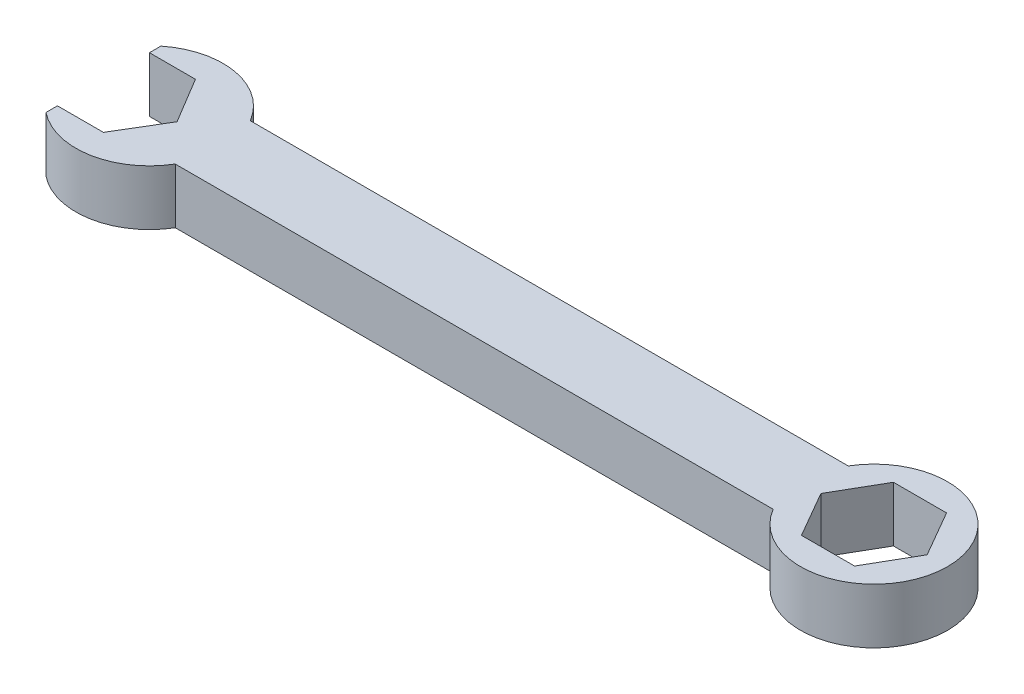
ISO-10303-21;
HEADER;
FILE_DESCRIPTION(('STEP AP214'),'2;1');
FILE_NAME('part.step','',(''),(''),'','','');
FILE_SCHEMA(('AUTOMOTIVE_DESIGN { 1 0 10303 214 1 1 1 1 }'));
ENDSEC;
DATA;
#1=APPLICATION_CONTEXT('core data for automotive mechanical design processes');
#2=APPLICATION_PROTOCOL_DEFINITION('international standard','automotive_design',2000,#1);
#3=PRODUCT_CONTEXT('',#1,'mechanical');
#4=PRODUCT('Part','Part','',(#3));
#5=PRODUCT_RELATED_PRODUCT_CATEGORY('part','',(#4));
#6=PRODUCT_DEFINITION_FORMATION('','',#4);
#7=PRODUCT_DEFINITION_CONTEXT('part definition',#1,'design');
#8=PRODUCT_DEFINITION('design','',#6,#7);
#9=PRODUCT_DEFINITION_SHAPE('','',#8);
#10=(LENGTH_UNIT() NAMED_UNIT(*) SI_UNIT(.MILLI.,.METRE.));
#11=(NAMED_UNIT(*) PLANE_ANGLE_UNIT() SI_UNIT($,.RADIAN.));
#12=(NAMED_UNIT(*) SI_UNIT($,.STERADIAN.) SOLID_ANGLE_UNIT());
#13=UNCERTAINTY_MEASURE_WITH_UNIT(LENGTH_MEASURE(1.E-05),#10,'distance_accuracy_value','');
#14=(GEOMETRIC_REPRESENTATION_CONTEXT(3) GLOBAL_UNCERTAINTY_ASSIGNED_CONTEXT((#13)) GLOBAL_UNIT_ASSIGNED_CONTEXT((#10,
#11,#12)) REPRESENTATION_CONTEXT('',''));
#15=CARTESIAN_POINT('',(0.,0.,0.));
#16=DIRECTION('',(0.,0.,1.));
#17=DIRECTION('',(1.,0.,0.));
#18=AXIS2_PLACEMENT_3D('',#15,#16,#17);
#19=CARTESIAN_POINT('',(77.6662616781043,7.62,-44.8406370868056));
#20=DIRECTION('',(-0.866025403784438,0.,0.500000000000001));
#21=DIRECTION('',(0.500000000000001,0.,0.866025403784438));
#22=AXIS2_PLACEMENT_3D('',#19,#20,#21);
#23=PLANE('',#22);
#24=DIRECTION('',(-0.500000000000001,0.,-0.866025403784438));
#25=VECTOR('',#24,1.);
#26=CARTESIAN_POINT('',(77.6662616781043,0.,-44.8406370868056));
#27=LINE('',#26,#25);
#28=CARTESIAN_POINT('',(103.555015570806,0.,0.));
#29=VERTEX_POINT('',#28);
#30=CARTESIAN_POINT('',(99.8888413614518,0.,-6.35000000000001));
#31=VERTEX_POINT('',#30);
#32=EDGE_CURVE('E248',#29,#31,#27,.T.);
#33=ORIENTED_EDGE('',*,*,#32,.F.);
#34=DIRECTION('',(0.,-1.,0.));
#35=VECTOR('',#34,1.);
#36=CARTESIAN_POINT('',(103.555015570806,7.62,0.));
#37=LINE('',#36,#35);
#38=CARTESIAN_POINT('',(103.555015570806,7.62,0.));
#39=VERTEX_POINT('',#38);
#40=EDGE_CURVE('E11',#39,#29,#37,.T.);
#41=ORIENTED_EDGE('',*,*,#40,.F.);
#42=DIRECTION('',(-0.500000000000001,0.,-0.866025403784438));
#43=VECTOR('',#42,1.);
#44=CARTESIAN_POINT('',(77.6662616781043,7.62,-44.8406370868056));
#45=LINE('',#44,#43);
#46=CARTESIAN_POINT('',(99.8888413614518,7.62,-6.35000000000001));
#47=VERTEX_POINT('',#46);
#48=EDGE_CURVE('E363',#39,#47,#45,.T.);
#49=ORIENTED_EDGE('',*,*,#48,.T.);
#50=DIRECTION('',(0.,-1.,0.));
#51=VECTOR('',#50,1.);
#52=CARTESIAN_POINT('',(99.8888413614518,7.62,-6.35000000000001));
#53=LINE('',#52,#51);
#54=EDGE_CURVE('E67',#47,#31,#53,.T.);
#55=ORIENTED_EDGE('',*,*,#54,.T.);
#56=EDGE_LOOP('',(#33,#41,#49,#55));
#57=FACE_BOUND('',#56,.T.);
#58=ADVANCED_FACE('F47',(#57),#23,.T.);
#59=CARTESIAN_POINT('',(77.6662616781043,7.62,44.8406370868056));
#60=DIRECTION('',(0.866025403784438,0.,0.500000000000001));
#61=DIRECTION('',(0.500000000000001,0.,-0.866025403784438));
#62=AXIS2_PLACEMENT_3D('',#59,#60,#61);
#63=PLANE('',#62);
#64=DIRECTION('',(-0.500000000000001,0.,0.866025403784438));
#65=VECTOR('',#64,1.);
#66=CARTESIAN_POINT('',(77.6662616781043,0.,44.8406370868056));
#67=LINE('',#66,#65);
#68=CARTESIAN_POINT('',(99.8888413614518,0.,6.35000000000001));
#69=VERTEX_POINT('',#68);
#70=EDGE_CURVE('E251',#29,#69,#67,.T.);
#71=ORIENTED_EDGE('',*,*,#70,.T.);
#72=DIRECTION('',(0.,-1.,0.));
#73=VECTOR('',#72,1.);
#74=CARTESIAN_POINT('',(99.8888413614518,7.62,6.35000000000001));
#75=LINE('',#74,#73);
#76=CARTESIAN_POINT('',(99.8888413614518,7.62,6.35000000000001));
#77=VERTEX_POINT('',#76);
#78=EDGE_CURVE('E58',#77,#69,#75,.T.);
#79=ORIENTED_EDGE('',*,*,#78,.F.);
#80=DIRECTION('',(-0.500000000000001,0.,0.866025403784438));
#81=VECTOR('',#80,1.);
#82=CARTESIAN_POINT('',(77.6662616781043,7.62,44.8406370868056));
#83=LINE('',#82,#81);
#84=EDGE_CURVE('E366',#39,#77,#83,.T.);
#85=ORIENTED_EDGE('',*,*,#84,.F.);
#86=ORIENTED_EDGE('',*,*,#40,.T.);
#87=EDGE_LOOP('',(#71,#79,#85,#86));
#88=FACE_BOUND('',#87,.T.);
#89=ADVANCED_FACE('F372',(#88),#63,.F.);
#90=CARTESIAN_POINT('',(0.,7.62,6.35));
#91=DIRECTION('',(0.,0.,1.));
#92=DIRECTION('',(1.,0.,0.));
#93=AXIS2_PLACEMENT_3D('',#90,#91,#92);
#94=PLANE('',#93);
#95=DIRECTION('',(-1.,0.,0.));
#96=VECTOR('',#95,1.);
#97=CARTESIAN_POINT('',(0.,0.,6.35));
#98=LINE('',#97,#96);
#99=CARTESIAN_POINT('',(92.5564929427435,0.,6.35000000000001));
#100=VERTEX_POINT('',#99);
#101=EDGE_CURVE('E255',#69,#100,#98,.T.);
#102=ORIENTED_EDGE('',*,*,#101,.T.);
#103=DIRECTION('',(0.,-1.,0.));
#104=VECTOR('',#103,1.);
#105=CARTESIAN_POINT('',(92.5564929427435,7.62,6.35000000000001));
#106=LINE('',#105,#104);
#107=CARTESIAN_POINT('',(92.5564929427435,7.62,6.35000000000001));
#108=VERTEX_POINT('',#107);
#109=EDGE_CURVE('E196',#108,#100,#106,.T.);
#110=ORIENTED_EDGE('',*,*,#109,.F.);
#111=DIRECTION('',(-1.,0.,0.));
#112=VECTOR('',#111,1.);
#113=CARTESIAN_POINT('',(0.,7.62,6.35));
#114=LINE('',#113,#112);
#115=EDGE_CURVE('E183',#77,#108,#114,.T.);
#116=ORIENTED_EDGE('',*,*,#115,.F.);
#117=ORIENTED_EDGE('',*,*,#78,.T.);
#118=EDGE_LOOP('',(#102,#110,#116,#117));
#119=FACE_BOUND('',#118,.T.);
#120=ADVANCED_FACE('F375',(#119),#94,.F.);
#121=CARTESIAN_POINT('',(66.6677390500421,7.62,-38.4906370868055));
#122=DIRECTION('',(-0.866025403784439,0.,0.499999999999999));
#123=DIRECTION('',(0.5,0.,0.866025403784439));
#124=AXIS2_PLACEMENT_3D('',#121,#122,#123);
#125=PLANE('',#124);
#126=DIRECTION('',(-0.499999999999999,0.,-0.866025403784439));
#127=VECTOR('',#126,1.);
#128=CARTESIAN_POINT('',(66.6677390500421,0.,-38.4906370868055));
#129=LINE('',#128,#127);
#130=CARTESIAN_POINT('',(88.8903187333894,0.,0.));
#131=VERTEX_POINT('',#130);
#132=EDGE_CURVE('E192',#100,#131,#129,.T.);
#133=ORIENTED_EDGE('',*,*,#132,.T.);
#134=DIRECTION('',(0.,-1.,0.));
#135=VECTOR('',#134,1.);
#136=CARTESIAN_POINT('',(88.8903187333894,7.62,0.));
#137=LINE('',#136,#135);
#138=CARTESIAN_POINT('',(88.8903187333894,7.62,0.));
#139=VERTEX_POINT('',#138);
#140=EDGE_CURVE('E190',#139,#131,#137,.T.);
#141=ORIENTED_EDGE('',*,*,#140,.F.);
#142=DIRECTION('',(-0.499999999999999,0.,-0.866025403784439));
#143=VECTOR('',#142,1.);
#144=CARTESIAN_POINT('',(66.6677390500421,7.62,-38.4906370868055));
#145=LINE('',#144,#143);
#146=EDGE_CURVE('E175',#108,#139,#145,.T.);
#147=ORIENTED_EDGE('',*,*,#146,.F.);
#148=ORIENTED_EDGE('',*,*,#109,.T.);
#149=EDGE_LOOP('',(#133,#141,#147,#148));
#150=FACE_BOUND('',#149,.T.);
#151=ADVANCED_FACE('F191',(#150),#125,.F.);
#152=CARTESIAN_POINT('',(66.667739050042,7.62,38.4906370868055));
#153=DIRECTION('',(0.866025403784439,0.,0.5));
#154=DIRECTION('',(0.5,0.,-0.866025403784439));
#155=AXIS2_PLACEMENT_3D('',#152,#153,#154);
#156=PLANE('',#155);
#157=DIRECTION('',(-0.5,0.,0.866025403784439));
#158=VECTOR('',#157,1.);
#159=CARTESIAN_POINT('',(66.667739050042,0.,38.4906370868055));
#160=LINE('',#159,#158);
#161=CARTESIAN_POINT('',(92.5564929427435,0.,-6.35000000000001));
#162=VERTEX_POINT('',#161);
#163=EDGE_CURVE('E261',#162,#131,#160,.T.);
#164=ORIENTED_EDGE('',*,*,#163,.F.);
#165=DIRECTION('',(0.,-1.,0.));
#166=VECTOR('',#165,1.);
#167=CARTESIAN_POINT('',(92.5564929427435,7.62,-6.35000000000001));
#168=LINE('',#167,#166);
#169=CARTESIAN_POINT('',(92.5564929427435,7.62,-6.35000000000001));
#170=VERTEX_POINT('',#169);
#171=EDGE_CURVE('E119',#170,#162,#168,.T.);
#172=ORIENTED_EDGE('',*,*,#171,.F.);
#173=DIRECTION('',(-0.5,0.,0.866025403784439));
#174=VECTOR('',#173,1.);
#175=CARTESIAN_POINT('',(66.667739050042,7.62,38.4906370868055));
#176=LINE('',#175,#174);
#177=EDGE_CURVE('E181',#170,#139,#176,.T.);
#178=ORIENTED_EDGE('',*,*,#177,.T.);
#179=ORIENTED_EDGE('',*,*,#140,.T.);
#180=EDGE_LOOP('',(#164,#172,#178,#179));
#181=FACE_BOUND('',#180,.T.);
#182=ADVANCED_FACE('F198',(#181),#156,.T.);
#183=CARTESIAN_POINT('',(96.2226671520976,7.62,0.));
#184=DIRECTION('',(0.,-1.,0.));
#185=DIRECTION('',(0.,0.,-1.));
#186=AXIS2_PLACEMENT_3D('',#183,#184,#185);
#187=CYLINDRICAL_SURFACE('',#186,10.16);
#188=CARTESIAN_POINT('',(96.2226671520976,0.,0.));
#189=DIRECTION('',(0.,1.,0.));
#190=DIRECTION('',(0.,0.,1.));
#191=AXIS2_PLACEMENT_3D('',#188,#189,#190);
#192=CIRCLE('',#191,10.16);
#193=CARTESIAN_POINT('',(87.4813335760488,0.,5.178289998855));
#194=VERTEX_POINT('',#193);
#195=CARTESIAN_POINT('',(87.4813335760488,0.,-5.178289998855));
#196=VERTEX_POINT('',#195);
#197=EDGE_CURVE('E207',#194,#196,#192,.T.);
#198=ORIENTED_EDGE('',*,*,#197,.T.);
#199=DIRECTION('',(0.,-1.,0.));
#200=VECTOR('',#199,1.);
#201=CARTESIAN_POINT('',(87.4813335760488,7.62,-5.178289998855));
#202=LINE('',#201,#200);
#203=CARTESIAN_POINT('',(87.4813335760488,7.62,-5.178289998855));
#204=VERTEX_POINT('',#203);
#205=EDGE_CURVE('E51',#204,#196,#202,.T.);
#206=ORIENTED_EDGE('',*,*,#205,.F.);
#207=CARTESIAN_POINT('',(96.2226671520976,7.62,0.));
#208=DIRECTION('',(0.,1.,0.));
#209=DIRECTION('',(0.,0.,1.));
#210=AXIS2_PLACEMENT_3D('',#207,#208,#209);
#211=CIRCLE('',#210,10.16);
#212=CARTESIAN_POINT('',(87.4813335760488,7.62,5.178289998855));
#213=VERTEX_POINT('',#212);
#214=EDGE_CURVE('E132',#213,#204,#211,.T.);
#215=ORIENTED_EDGE('',*,*,#214,.F.);
#216=DIRECTION('',(0.,-1.,0.));
#217=VECTOR('',#216,1.);
#218=CARTESIAN_POINT('',(87.4813335760488,7.62,5.178289998855));
#219=LINE('',#218,#217);
#220=EDGE_CURVE('E203',#213,#194,#219,.T.);
#221=ORIENTED_EDGE('',*,*,#220,.T.);
#222=EDGE_LOOP('',(#198,#206,#215,#221));
#223=FACE_BOUND('',#222,.T.);
#224=ADVANCED_FACE('F49',(#223),#187,.T.);
#225=CARTESIAN_POINT('',(0.,7.62,-5.178289998855));
#226=DIRECTION('',(0.,0.,-1.));
#227=DIRECTION('',(-1.,0.,0.));
#228=AXIS2_PLACEMENT_3D('',#225,#226,#227);
#229=PLANE('',#228);
#230=DIRECTION('',(1.,0.,0.));
#231=VECTOR('',#230,1.);
#232=CARTESIAN_POINT('',(0.,0.,-5.178289998855));
#233=LINE('',#232,#231);
#234=CARTESIAN_POINT('',(4.93133357604881,0.,-5.178289998855));
#235=VERTEX_POINT('',#234);
#236=EDGE_CURVE('E211',#235,#196,#233,.T.);
#237=ORIENTED_EDGE('',*,*,#236,.F.);
#238=DIRECTION('',(0.,-1.,0.));
#239=VECTOR('',#238,1.);
#240=CARTESIAN_POINT('',(4.93133357604881,7.62,-5.178289998855));
#241=LINE('',#240,#239);
#242=CARTESIAN_POINT('',(4.93133357604881,7.62,-5.178289998855));
#243=VERTEX_POINT('',#242);
#244=EDGE_CURVE('E305',#243,#235,#241,.T.);
#245=ORIENTED_EDGE('',*,*,#244,.F.);
#246=DIRECTION('',(1.,0.,0.));
#247=VECTOR('',#246,1.);
#248=CARTESIAN_POINT('',(0.,7.62,-5.178289998855));
#249=LINE('',#248,#247);
#250=EDGE_CURVE('E315',#243,#204,#249,.T.);
#251=ORIENTED_EDGE('',*,*,#250,.T.);
#252=ORIENTED_EDGE('',*,*,#205,.T.);
#253=EDGE_LOOP('',(#237,#245,#251,#252));
#254=FACE_BOUND('',#253,.T.);
#255=ADVANCED_FACE('F314',(#254),#229,.T.);
#256=CARTESIAN_POINT('',(-3.81,7.62,0.));
#257=DIRECTION('',(0.,-1.,0.));
#258=DIRECTION('',(0.,0.,-1.));
#259=AXIS2_PLACEMENT_3D('',#256,#257,#258);
#260=CYLINDRICAL_SURFACE('',#259,10.16);
#261=CARTESIAN_POINT('',(-3.81,0.,0.));
#262=DIRECTION('',(0.,1.,0.));
#263=DIRECTION('',(0.,0.,1.));
#264=AXIS2_PLACEMENT_3D('',#261,#262,#263);
#265=CIRCLE('',#264,10.16);
#266=CARTESIAN_POINT('',(-10.16,0.,-7.93114745796596));
#267=VERTEX_POINT('',#266);
#268=EDGE_CURVE('E215',#235,#267,#265,.T.);
#269=ORIENTED_EDGE('',*,*,#268,.T.);
#270=DIRECTION('',(0.,-1.,0.));
#271=VECTOR('',#270,1.);
#272=CARTESIAN_POINT('',(-10.16,7.62,-7.93114745796596));
#273=LINE('',#272,#271);
#274=CARTESIAN_POINT('',(-10.16,7.62,-7.93114745796596));
#275=VERTEX_POINT('',#274);
#276=EDGE_CURVE('E303',#275,#267,#273,.T.);
#277=ORIENTED_EDGE('',*,*,#276,.F.);
#278=CARTESIAN_POINT('',(-3.81,7.62,0.));
#279=DIRECTION('',(0.,1.,0.));
#280=DIRECTION('',(0.,0.,1.));
#281=AXIS2_PLACEMENT_3D('',#278,#279,#280);
#282=CIRCLE('',#281,10.16);
#283=EDGE_CURVE('E327',#243,#275,#282,.T.);
#284=ORIENTED_EDGE('',*,*,#283,.F.);
#285=ORIENTED_EDGE('',*,*,#244,.T.);
#286=EDGE_LOOP('',(#269,#277,#284,#285));
#287=FACE_BOUND('',#286,.T.);
#288=ADVANCED_FACE('F325',(#287),#260,.T.);
#289=CARTESIAN_POINT('',(-10.16,7.62,0.));
#290=DIRECTION('',(-1.,0.,0.));
#291=DIRECTION('',(0.,0.,1.));
#292=AXIS2_PLACEMENT_3D('',#289,#290,#291);
#293=PLANE('',#292);
#294=DIRECTION('',(0.,0.,-1.));
#295=VECTOR('',#294,1.);
#296=CARTESIAN_POINT('',(-10.16,0.,0.));
#297=LINE('',#296,#295);
#298=CARTESIAN_POINT('',(-10.16,0.,-6.35));
#299=VERTEX_POINT('',#298);
#300=EDGE_CURVE('E219',#299,#267,#297,.T.);
#301=ORIENTED_EDGE('',*,*,#300,.F.);
#302=DIRECTION('',(0.,-1.,0.));
#303=VECTOR('',#302,1.);
#304=CARTESIAN_POINT('',(-10.16,7.62,-6.35));
#305=LINE('',#304,#303);
#306=CARTESIAN_POINT('',(-10.16,7.62,-6.35));
#307=VERTEX_POINT('',#306);
#308=EDGE_CURVE('E300',#307,#299,#305,.T.);
#309=ORIENTED_EDGE('',*,*,#308,.F.);
#310=DIRECTION('',(0.,0.,-1.));
#311=VECTOR('',#310,1.);
#312=CARTESIAN_POINT('',(-10.16,7.62,0.));
#313=LINE('',#312,#311);
#314=EDGE_CURVE('E330',#307,#275,#313,.T.);
#315=ORIENTED_EDGE('',*,*,#314,.T.);
#316=ORIENTED_EDGE('',*,*,#276,.T.);
#317=EDGE_LOOP('',(#301,#309,#315,#316));
#318=FACE_BOUND('',#317,.T.);
#319=ADVANCED_FACE('F331',(#318),#293,.T.);
#320=CARTESIAN_POINT('',(0.,7.62,-6.35));
#321=DIRECTION('',(0.,0.,1.));
#322=DIRECTION('',(1.,0.,0.));
#323=AXIS2_PLACEMENT_3D('',#320,#321,#322);
#324=PLANE('',#323);
#325=DIRECTION('',(-1.,0.,0.));
#326=VECTOR('',#325,1.);
#327=CARTESIAN_POINT('',(0.,0.,-6.35));
#328=LINE('',#327,#326);
#329=CARTESIAN_POINT('',(-3.81,0.,-6.35));
#330=VERTEX_POINT('',#329);
#331=EDGE_CURVE('E223',#330,#299,#328,.T.);
#332=ORIENTED_EDGE('',*,*,#331,.F.);
#333=DIRECTION('',(0.,-1.,0.));
#334=VECTOR('',#333,1.);
#335=CARTESIAN_POINT('',(-3.81,7.62,-6.35));
#336=LINE('',#335,#334);
#337=CARTESIAN_POINT('',(-3.81,7.62,-6.35));
#338=VERTEX_POINT('',#337);
#339=EDGE_CURVE('E297',#338,#330,#336,.T.);
#340=ORIENTED_EDGE('',*,*,#339,.F.);
#341=DIRECTION('',(-1.,0.,0.));
#342=VECTOR('',#341,1.);
#343=CARTESIAN_POINT('',(0.,7.62,-6.35));
#344=LINE('',#343,#342);
#345=EDGE_CURVE('E335',#338,#307,#344,.T.);
#346=ORIENTED_EDGE('',*,*,#345,.T.);
#347=ORIENTED_EDGE('',*,*,#308,.T.);
#348=EDGE_LOOP('',(#332,#340,#346,#347));
#349=FACE_BOUND('',#348,.T.);
#350=ADVANCED_FACE('F416',(#349),#324,.T.);
#351=CARTESIAN_POINT('',(0.,7.62,0.));
#352=DIRECTION('',(-0.857492925712544,0.,0.514495755427527));
#353=DIRECTION('',(0.514495755427527,0.,0.857492925712544));
#354=AXIS2_PLACEMENT_3D('',#351,#352,#353);
#355=PLANE('',#354);
#356=DIRECTION('',(-0.514495755427527,0.,-0.857492925712544));
#357=VECTOR('',#356,1.);
#358=CARTESIAN_POINT('',(0.,0.,0.));
#359=LINE('',#358,#357);
#360=CARTESIAN_POINT('',(0.,0.,0.));
#361=VERTEX_POINT('',#360);
#362=EDGE_CURVE('E227',#361,#330,#359,.T.);
#363=ORIENTED_EDGE('',*,*,#362,.F.);
#364=DIRECTION('',(0.,-1.,0.));
#365=VECTOR('',#364,1.);
#366=CARTESIAN_POINT('',(0.,7.62,0.));
#367=LINE('',#366,#365);
#368=CARTESIAN_POINT('',(0.,7.62,0.));
#369=VERTEX_POINT('',#368);
#370=EDGE_CURVE('E294',#369,#361,#367,.T.);
#371=ORIENTED_EDGE('',*,*,#370,.F.);
#372=DIRECTION('',(-0.514495755427527,0.,-0.857492925712544));
#373=VECTOR('',#372,1.);
#374=CARTESIAN_POINT('',(0.,7.62,0.));
#375=LINE('',#374,#373);
#376=EDGE_CURVE('E339',#369,#338,#375,.T.);
#377=ORIENTED_EDGE('',*,*,#376,.T.);
#378=ORIENTED_EDGE('',*,*,#339,.T.);
#379=EDGE_LOOP('',(#363,#371,#377,#378));
#380=FACE_BOUND('',#379,.T.);
#381=ADVANCED_FACE('F412',(#380),#355,.T.);
#382=CARTESIAN_POINT('',(0.,7.62,0.));
#383=DIRECTION('',(0.857492925712544,0.,0.514495755427527));
#384=DIRECTION('',(0.514495755427527,0.,-0.857492925712544));
#385=AXIS2_PLACEMENT_3D('',#382,#383,#384);
#386=PLANE('',#385);
#387=DIRECTION('',(-0.514495755427527,0.,0.857492925712544));
#388=VECTOR('',#387,1.);
#389=CARTESIAN_POINT('',(0.,0.,0.));
#390=LINE('',#389,#388);
#391=CARTESIAN_POINT('',(-3.81,0.,6.35));
#392=VERTEX_POINT('',#391);
#393=EDGE_CURVE('E231',#361,#392,#390,.T.);
#394=ORIENTED_EDGE('',*,*,#393,.T.);
#395=DIRECTION('',(0.,-1.,0.));
#396=VECTOR('',#395,1.);
#397=CARTESIAN_POINT('',(-3.81,7.62,6.35));
#398=LINE('',#397,#396);
#399=CARTESIAN_POINT('',(-3.81,7.62,6.35));
#400=VERTEX_POINT('',#399);
#401=EDGE_CURVE('E290',#400,#392,#398,.T.);
#402=ORIENTED_EDGE('',*,*,#401,.F.);
#403=DIRECTION('',(-0.514495755427527,0.,0.857492925712544));
#404=VECTOR('',#403,1.);
#405=CARTESIAN_POINT('',(0.,7.62,0.));
#406=LINE('',#405,#404);
#407=EDGE_CURVE('E347',#369,#400,#406,.T.);
#408=ORIENTED_EDGE('',*,*,#407,.F.);
#409=ORIENTED_EDGE('',*,*,#370,.T.);
#410=EDGE_LOOP('',(#394,#402,#408,#409));
#411=FACE_BOUND('',#410,.T.);
#412=ADVANCED_FACE('F408',(#411),#386,.F.);
#413=CARTESIAN_POINT('',(0.,7.62,6.35));
#414=DIRECTION('',(0.,0.,1.));
#415=DIRECTION('',(1.,0.,0.));
#416=AXIS2_PLACEMENT_3D('',#413,#414,#415);
#417=PLANE('',#416);
#418=DIRECTION('',(-1.,0.,0.));
#419=VECTOR('',#418,1.);
#420=CARTESIAN_POINT('',(0.,0.,6.35));
#421=LINE('',#420,#419);
#422=CARTESIAN_POINT('',(-10.16,0.,6.35));
#423=VERTEX_POINT('',#422);
#424=EDGE_CURVE('E234',#392,#423,#421,.T.);
#425=ORIENTED_EDGE('',*,*,#424,.T.);
#426=DIRECTION('',(0.,-1.,0.));
#427=VECTOR('',#426,1.);
#428=CARTESIAN_POINT('',(-10.16,7.62,6.35));
#429=LINE('',#428,#427);
#430=CARTESIAN_POINT('',(-10.16,7.62,6.35));
#431=VERTEX_POINT('',#430);
#432=EDGE_CURVE('E286',#431,#423,#429,.T.);
#433=ORIENTED_EDGE('',*,*,#432,.F.);
#434=DIRECTION('',(-1.,0.,0.));
#435=VECTOR('',#434,1.);
#436=CARTESIAN_POINT('',(0.,7.62,6.35));
#437=LINE('',#436,#435);
#438=EDGE_CURVE('E350',#400,#431,#437,.T.);
#439=ORIENTED_EDGE('',*,*,#438,.F.);
#440=ORIENTED_EDGE('',*,*,#401,.T.);
#441=EDGE_LOOP('',(#425,#433,#439,#440));
#442=FACE_BOUND('',#441,.T.);
#443=ADVANCED_FACE('F404',(#442),#417,.F.);
#444=CARTESIAN_POINT('',(-10.16,7.62,0.));
#445=DIRECTION('',(1.,0.,0.));
#446=DIRECTION('',(0.,0.,-1.));
#447=AXIS2_PLACEMENT_3D('',#444,#445,#446);
#448=PLANE('',#447);
#449=DIRECTION('',(0.,0.,1.));
#450=VECTOR('',#449,1.);
#451=CARTESIAN_POINT('',(-10.16,0.,0.));
#452=LINE('',#451,#450);
#453=CARTESIAN_POINT('',(-10.16,0.,7.93114745796596));
#454=VERTEX_POINT('',#453);
#455=EDGE_CURVE('E237',#423,#454,#452,.T.);
#456=ORIENTED_EDGE('',*,*,#455,.T.);
#457=DIRECTION('',(0.,-1.,0.));
#458=VECTOR('',#457,1.);
#459=CARTESIAN_POINT('',(-10.16,7.62,7.93114745796596));
#460=LINE('',#459,#458);
#461=CARTESIAN_POINT('',(-10.16,7.62,7.93114745796596));
#462=VERTEX_POINT('',#461);
#463=EDGE_CURVE('E283',#462,#454,#460,.T.);
#464=ORIENTED_EDGE('',*,*,#463,.F.);
#465=DIRECTION('',(0.,0.,1.));
#466=VECTOR('',#465,1.);
#467=CARTESIAN_POINT('',(-10.16,7.62,0.));
#468=LINE('',#467,#466);
#469=EDGE_CURVE('E353',#431,#462,#468,.T.);
#470=ORIENTED_EDGE('',*,*,#469,.F.);
#471=ORIENTED_EDGE('',*,*,#432,.T.);
#472=EDGE_LOOP('',(#456,#464,#470,#471));
#473=FACE_BOUND('',#472,.T.);
#474=ADVANCED_FACE('F400',(#473),#448,.F.);
#475=CARTESIAN_POINT('',(-3.81,7.62,0.));
#476=DIRECTION('',(0.,-1.,0.));
#477=DIRECTION('',(0.,0.,-1.));
#478=AXIS2_PLACEMENT_3D('',#475,#476,#477);
#479=CYLINDRICAL_SURFACE('',#478,10.16);
#480=CARTESIAN_POINT('',(-3.81,0.,0.));
#481=DIRECTION('',(0.,1.,0.));
#482=DIRECTION('',(0.,0.,1.));
#483=AXIS2_PLACEMENT_3D('',#480,#481,#482);
#484=CIRCLE('',#483,10.16);
#485=CARTESIAN_POINT('',(4.93133357604881,0.,5.178289998855));
#486=VERTEX_POINT('',#485);
#487=EDGE_CURVE('E241',#486,#454,#484,.F.);
#488=ORIENTED_EDGE('',*,*,#487,.F.);
#489=DIRECTION('',(0.,-1.,0.));
#490=VECTOR('',#489,1.);
#491=CARTESIAN_POINT('',(4.93133357604881,7.62,5.178289998855));
#492=LINE('',#491,#490);
#493=CARTESIAN_POINT('',(4.93133357604881,7.62,5.178289998855));
#494=VERTEX_POINT('',#493);
#495=EDGE_CURVE('E280',#494,#486,#492,.T.);
#496=ORIENTED_EDGE('',*,*,#495,.F.);
#497=CARTESIAN_POINT('',(-3.81,7.62,0.));
#498=DIRECTION('',(0.,1.,0.));
#499=DIRECTION('',(0.,0.,1.));
#500=AXIS2_PLACEMENT_3D('',#497,#498,#499);
#501=CIRCLE('',#500,10.16);
#502=EDGE_CURVE('E356',#494,#462,#501,.F.);
#503=ORIENTED_EDGE('',*,*,#502,.T.);
#504=ORIENTED_EDGE('',*,*,#463,.T.);
#505=EDGE_LOOP('',(#488,#496,#503,#504));
#506=FACE_BOUND('',#505,.T.);
#507=ADVANCED_FACE('F385',(#506),#479,.T.);
#508=CARTESIAN_POINT('',(0.,7.62,5.178289998855));
#509=DIRECTION('',(0.,0.,-1.));
#510=DIRECTION('',(-1.,0.,0.));
#511=AXIS2_PLACEMENT_3D('',#508,#509,#510);
#512=PLANE('',#511);
#513=DIRECTION('',(1.,0.,0.));
#514=VECTOR('',#513,1.);
#515=CARTESIAN_POINT('',(0.,0.,5.178289998855));
#516=LINE('',#515,#514);
#517=EDGE_CURVE('E245',#486,#194,#516,.T.);
#518=ORIENTED_EDGE('',*,*,#517,.T.);
#519=ORIENTED_EDGE('',*,*,#220,.F.);
#520=DIRECTION('',(1.,0.,0.));
#521=VECTOR('',#520,1.);
#522=CARTESIAN_POINT('',(0.,7.62,5.178289998855));
#523=LINE('',#522,#521);
#524=EDGE_CURVE('E360',#494,#213,#523,.T.);
#525=ORIENTED_EDGE('',*,*,#524,.F.);
#526=ORIENTED_EDGE('',*,*,#495,.T.);
#527=EDGE_LOOP('',(#518,#519,#525,#526));
#528=FACE_BOUND('',#527,.T.);
#529=ADVANCED_FACE('F378',(#528),#512,.F.);
#530=CARTESIAN_POINT('',(0.,7.62,-6.35));
#531=DIRECTION('',(0.,0.,1.));
#532=DIRECTION('',(1.,0.,0.));
#533=AXIS2_PLACEMENT_3D('',#530,#531,#532);
#534=PLANE('',#533);
#535=DIRECTION('',(-1.,0.,0.));
#536=VECTOR('',#535,1.);
#537=CARTESIAN_POINT('',(0.,0.,-6.35));
#538=LINE('',#537,#536);
#539=EDGE_CURVE('E264',#31,#162,#538,.T.);
#540=ORIENTED_EDGE('',*,*,#539,.F.);
#541=ORIENTED_EDGE('',*,*,#54,.F.);
#542=DIRECTION('',(-1.,0.,0.));
#543=VECTOR('',#542,1.);
#544=CARTESIAN_POINT('',(0.,7.62,-6.35));
#545=LINE('',#544,#543);
#546=EDGE_CURVE('E200',#47,#170,#545,.T.);
#547=ORIENTED_EDGE('',*,*,#546,.T.);
#548=ORIENTED_EDGE('',*,*,#171,.T.);
#549=EDGE_LOOP('',(#540,#541,#547,#548));
#550=FACE_BOUND('',#549,.T.);
#551=ADVANCED_FACE('F376',(#550),#534,.T.);
#552=CARTESIAN_POINT('',(0.,7.62,0.));
#553=DIRECTION('',(0.,1.,0.));
#554=DIRECTION('',(0.,0.,1.));
#555=AXIS2_PLACEMENT_3D('',#552,#553,#554);
#556=PLANE('',#555);
#557=ORIENTED_EDGE('',*,*,#214,.T.);
#558=ORIENTED_EDGE('',*,*,#250,.F.);
#559=ORIENTED_EDGE('',*,*,#283,.T.);
#560=ORIENTED_EDGE('',*,*,#314,.F.);
#561=ORIENTED_EDGE('',*,*,#345,.F.);
#562=ORIENTED_EDGE('',*,*,#376,.F.);
#563=ORIENTED_EDGE('',*,*,#407,.T.);
#564=ORIENTED_EDGE('',*,*,#438,.T.);
#565=ORIENTED_EDGE('',*,*,#469,.T.);
#566=ORIENTED_EDGE('',*,*,#502,.F.);
#567=ORIENTED_EDGE('',*,*,#524,.T.);
#568=EDGE_LOOP('',(#557,#558,#559,#560,#561,#562,#563,#564,#565,#566,#567));
#569=FACE_BOUND('',#568,.T.);
#570=ORIENTED_EDGE('',*,*,#48,.F.);
#571=ORIENTED_EDGE('',*,*,#84,.T.);
#572=ORIENTED_EDGE('',*,*,#115,.T.);
#573=ORIENTED_EDGE('',*,*,#146,.T.);
#574=ORIENTED_EDGE('',*,*,#177,.F.);
#575=ORIENTED_EDGE('',*,*,#546,.F.);
#576=EDGE_LOOP('',(#570,#571,#572,#573,#574,#575));
#577=FACE_BOUND('',#576,.T.);
#578=ADVANCED_FACE('F178',(#569,#577),#556,.T.);
#579=CARTESIAN_POINT('',(0.,0.,0.));
#580=DIRECTION('',(0.,1.,0.));
#581=DIRECTION('',(0.,0.,1.));
#582=AXIS2_PLACEMENT_3D('',#579,#580,#581);
#583=PLANE('',#582);
#584=ORIENTED_EDGE('',*,*,#197,.F.);
#585=ORIENTED_EDGE('',*,*,#517,.F.);
#586=ORIENTED_EDGE('',*,*,#487,.T.);
#587=ORIENTED_EDGE('',*,*,#455,.F.);
#588=ORIENTED_EDGE('',*,*,#424,.F.);
#589=ORIENTED_EDGE('',*,*,#393,.F.);
#590=ORIENTED_EDGE('',*,*,#362,.T.);
#591=ORIENTED_EDGE('',*,*,#331,.T.);
#592=ORIENTED_EDGE('',*,*,#300,.T.);
#593=ORIENTED_EDGE('',*,*,#268,.F.);
#594=ORIENTED_EDGE('',*,*,#236,.T.);
#595=EDGE_LOOP('',(#584,#585,#586,#587,#588,#589,#590,#591,#592,#593,#594));
#596=FACE_BOUND('',#595,.T.);
#597=ORIENTED_EDGE('',*,*,#32,.T.);
#598=ORIENTED_EDGE('',*,*,#539,.T.);
#599=ORIENTED_EDGE('',*,*,#163,.T.);
#600=ORIENTED_EDGE('',*,*,#132,.F.);
#601=ORIENTED_EDGE('',*,*,#101,.F.);
#602=ORIENTED_EDGE('',*,*,#70,.F.);
#603=EDGE_LOOP('',(#597,#598,#599,#600,#601,#602));
#604=FACE_BOUND('',#603,.T.);
#605=ADVANCED_FACE('F321',(#596,#604),#583,.F.);
#606=CLOSED_SHELL('',(#58,#89,#120,#151,#182,#224,#255,#288,#319,#350,#381,#412,#443,#474,#507,
#529,#551,#578,#605));
#607=MANIFOLD_SOLID_BREP('B2',#606);
#608=ADVANCED_BREP_SHAPE_REPRESENTATION('',(#18,#607),#14);
#609=SHAPE_DEFINITION_REPRESENTATION(#9,#608);
ENDSEC;
END-ISO-10303-21;
